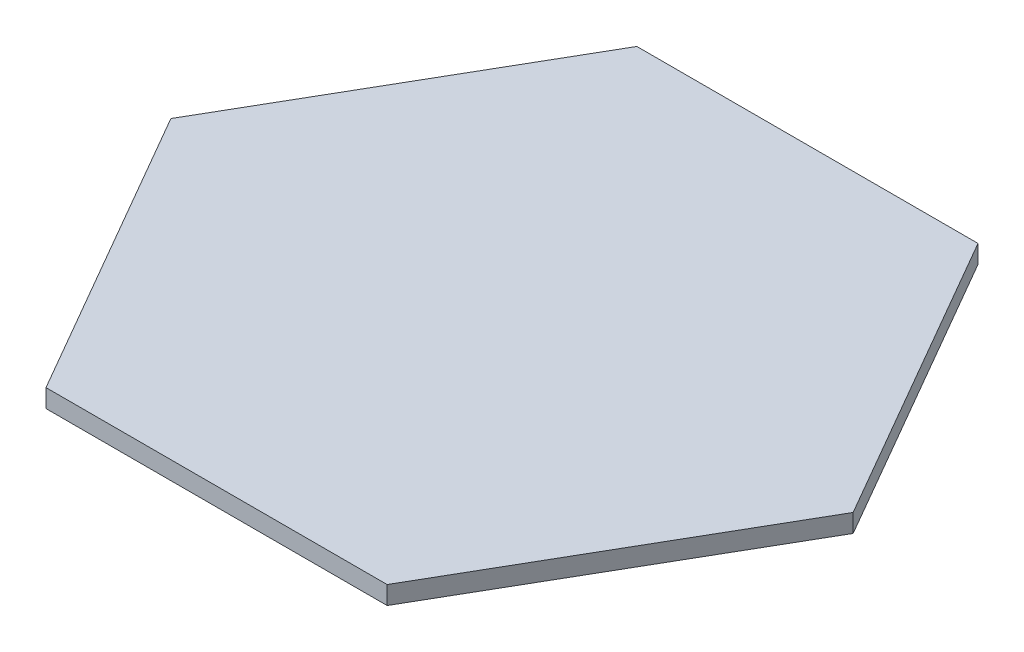
ISO-10303-21;
HEADER;
FILE_DESCRIPTION(('STEP AP214'),'2;1');
FILE_NAME('part.step','',(''),(''),'','','');
FILE_SCHEMA(('AUTOMOTIVE_DESIGN { 1 0 10303 214 1 1 1 1 }'));
ENDSEC;
DATA;
#1=APPLICATION_CONTEXT('core data for automotive mechanical design processes');
#2=APPLICATION_PROTOCOL_DEFINITION('international standard','automotive_design',2000,#1);
#3=PRODUCT_CONTEXT('',#1,'mechanical');
#4=PRODUCT('Part','Part','',(#3));
#5=PRODUCT_RELATED_PRODUCT_CATEGORY('part','',(#4));
#6=PRODUCT_DEFINITION_FORMATION('','',#4);
#7=PRODUCT_DEFINITION_CONTEXT('part definition',#1,'design');
#8=PRODUCT_DEFINITION('design','',#6,#7);
#9=PRODUCT_DEFINITION_SHAPE('','',#8);
#10=(LENGTH_UNIT() NAMED_UNIT(*) SI_UNIT(.MILLI.,.METRE.));
#11=(NAMED_UNIT(*) PLANE_ANGLE_UNIT() SI_UNIT($,.RADIAN.));
#12=(NAMED_UNIT(*) SI_UNIT($,.STERADIAN.) SOLID_ANGLE_UNIT());
#13=UNCERTAINTY_MEASURE_WITH_UNIT(LENGTH_MEASURE(1.E-05),#10,'distance_accuracy_value','');
#14=(GEOMETRIC_REPRESENTATION_CONTEXT(3) GLOBAL_UNCERTAINTY_ASSIGNED_CONTEXT((#13)) GLOBAL_UNIT_ASSIGNED_CONTEXT((#10,
#11,#12)) REPRESENTATION_CONTEXT('',''));
#15=CARTESIAN_POINT('',(0.,0.,0.));
#16=DIRECTION('',(0.,0.,1.));
#17=DIRECTION('',(1.,0.,0.));
#18=AXIS2_PLACEMENT_3D('',#15,#16,#17);
#19=CARTESIAN_POINT('',(-95.25,5.08,0.));
#20=DIRECTION('',(0.866025403784439,0.,-0.5));
#21=DIRECTION('',(-0.5,0.,-0.866025403784439));
#22=AXIS2_PLACEMENT_3D('',#19,#20,#21);
#23=PLANE('',#22);
#24=DIRECTION('',(0.5,0.,0.866025403784439));
#25=VECTOR('',#24,1.);
#26=CARTESIAN_POINT('',(-95.25,0.,0.));
#27=LINE('',#26,#25);
#28=CARTESIAN_POINT('',(-95.25,0.,0.));
#29=VERTEX_POINT('',#28);
#30=CARTESIAN_POINT('',(-47.625,0.,82.4889197104678));
#31=VERTEX_POINT('',#30);
#32=EDGE_CURVE('E116',#29,#31,#27,.T.);
#33=ORIENTED_EDGE('',*,*,#32,.T.);
#34=DIRECTION('',(0.,-1.,0.));
#35=VECTOR('',#34,1.);
#36=CARTESIAN_POINT('',(-47.625,5.08,82.4889197104678));
#37=LINE('',#36,#35);
#38=CARTESIAN_POINT('',(-47.625,5.08,82.4889197104678));
#39=VERTEX_POINT('',#38);
#40=EDGE_CURVE('E11',#39,#31,#37,.T.);
#41=ORIENTED_EDGE('',*,*,#40,.F.);
#42=DIRECTION('',(0.5,0.,0.866025403784439));
#43=VECTOR('',#42,1.);
#44=CARTESIAN_POINT('',(-95.25,5.08,0.));
#45=LINE('',#44,#43);
#46=CARTESIAN_POINT('',(-95.25,5.08,0.));
#47=VERTEX_POINT('',#46);
#48=EDGE_CURVE('E126',#47,#39,#45,.T.);
#49=ORIENTED_EDGE('',*,*,#48,.F.);
#50=DIRECTION('',(0.,-1.,0.));
#51=VECTOR('',#50,1.);
#52=CARTESIAN_POINT('',(-95.25,5.08,0.));
#53=LINE('',#52,#51);
#54=EDGE_CURVE('E112',#47,#29,#53,.T.);
#55=ORIENTED_EDGE('',*,*,#54,.T.);
#56=EDGE_LOOP('',(#33,#41,#49,#55));
#57=FACE_BOUND('',#56,.T.);
#58=ADVANCED_FACE('F32',(#57),#23,.F.);
#59=CARTESIAN_POINT('',(-47.625,5.08,82.4889197104678));
#60=DIRECTION('',(0.,0.,-1.));
#61=DIRECTION('',(-1.,0.,0.));
#62=AXIS2_PLACEMENT_3D('',#59,#60,#61);
#63=PLANE('',#62);
#64=DIRECTION('',(1.,0.,0.));
#65=VECTOR('',#64,1.);
#66=CARTESIAN_POINT('',(-47.625,0.,82.4889197104678));
#67=LINE('',#66,#65);
#68=CARTESIAN_POINT('',(47.6249999999999,0.,82.4889197104678));
#69=VERTEX_POINT('',#68);
#70=EDGE_CURVE('E119',#31,#69,#67,.T.);
#71=ORIENTED_EDGE('',*,*,#70,.T.);
#72=DIRECTION('',(0.,-1.,0.));
#73=VECTOR('',#72,1.);
#74=CARTESIAN_POINT('',(47.6249999999999,5.08,82.4889197104678));
#75=LINE('',#74,#73);
#76=CARTESIAN_POINT('',(47.6249999999999,5.08,82.4889197104678));
#77=VERTEX_POINT('',#76);
#78=EDGE_CURVE('E40',#77,#69,#75,.T.);
#79=ORIENTED_EDGE('',*,*,#78,.F.);
#80=DIRECTION('',(1.,0.,0.));
#81=VECTOR('',#80,1.);
#82=CARTESIAN_POINT('',(-47.625,5.08,82.4889197104678));
#83=LINE('',#82,#81);
#84=EDGE_CURVE('E85',#39,#77,#83,.T.);
#85=ORIENTED_EDGE('',*,*,#84,.F.);
#86=ORIENTED_EDGE('',*,*,#40,.T.);
#87=EDGE_LOOP('',(#71,#79,#85,#86));
#88=FACE_BOUND('',#87,.T.);
#89=ADVANCED_FACE('F150',(#88),#63,.F.);
#90=CARTESIAN_POINT('',(47.6249999999999,5.08,82.4889197104678));
#91=DIRECTION('',(-0.866025403784438,0.,-0.500000000000001));
#92=DIRECTION('',(-0.500000000000001,0.,0.866025403784438));
#93=AXIS2_PLACEMENT_3D('',#90,#91,#92);
#94=PLANE('',#93);
#95=DIRECTION('',(0.500000000000001,0.,-0.866025403784438));
#96=VECTOR('',#95,1.);
#97=CARTESIAN_POINT('',(47.6249999999999,0.,82.4889197104678));
#98=LINE('',#97,#96);
#99=CARTESIAN_POINT('',(95.25,0.,0.));
#100=VERTEX_POINT('',#99);
#101=EDGE_CURVE('E121',#69,#100,#98,.T.);
#102=ORIENTED_EDGE('',*,*,#101,.T.);
#103=DIRECTION('',(0.,-1.,0.));
#104=VECTOR('',#103,1.);
#105=CARTESIAN_POINT('',(95.25,5.08,0.));
#106=LINE('',#105,#104);
#107=CARTESIAN_POINT('',(95.25,5.08,0.));
#108=VERTEX_POINT('',#107);
#109=EDGE_CURVE('E107',#108,#100,#106,.T.);
#110=ORIENTED_EDGE('',*,*,#109,.F.);
#111=DIRECTION('',(0.500000000000001,0.,-0.866025403784438));
#112=VECTOR('',#111,1.);
#113=CARTESIAN_POINT('',(47.6249999999999,5.08,82.4889197104678));
#114=LINE('',#113,#112);
#115=EDGE_CURVE('E98',#77,#108,#114,.T.);
#116=ORIENTED_EDGE('',*,*,#115,.F.);
#117=ORIENTED_EDGE('',*,*,#78,.T.);
#118=EDGE_LOOP('',(#102,#110,#116,#117));
#119=FACE_BOUND('',#118,.T.);
#120=ADVANCED_FACE('F132',(#119),#94,.F.);
#121=CARTESIAN_POINT('',(95.25,5.08,0.));
#122=DIRECTION('',(-0.866025403784438,0.,0.500000000000001));
#123=DIRECTION('',(0.500000000000001,0.,0.866025403784438));
#124=AXIS2_PLACEMENT_3D('',#121,#122,#123);
#125=PLANE('',#124);
#126=DIRECTION('',(-0.500000000000001,0.,-0.866025403784438));
#127=VECTOR('',#126,1.);
#128=CARTESIAN_POINT('',(95.25,0.,0.));
#129=LINE('',#128,#127);
#130=CARTESIAN_POINT('',(47.6249999999999,0.,-82.4889197104678));
#131=VERTEX_POINT('',#130);
#132=EDGE_CURVE('E106',#100,#131,#129,.T.);
#133=ORIENTED_EDGE('',*,*,#132,.T.);
#134=DIRECTION('',(0.,-1.,0.));
#135=VECTOR('',#134,1.);
#136=CARTESIAN_POINT('',(47.6249999999999,5.08,-82.4889197104678));
#137=LINE('',#136,#135);
#138=CARTESIAN_POINT('',(47.6249999999999,5.08,-82.4889197104678));
#139=VERTEX_POINT('',#138);
#140=EDGE_CURVE('E103',#139,#131,#137,.T.);
#141=ORIENTED_EDGE('',*,*,#140,.F.);
#142=DIRECTION('',(-0.500000000000001,0.,-0.866025403784438));
#143=VECTOR('',#142,1.);
#144=CARTESIAN_POINT('',(95.25,5.08,0.));
#145=LINE('',#144,#143);
#146=EDGE_CURVE('E92',#108,#139,#145,.T.);
#147=ORIENTED_EDGE('',*,*,#146,.F.);
#148=ORIENTED_EDGE('',*,*,#109,.T.);
#149=EDGE_LOOP('',(#133,#141,#147,#148));
#150=FACE_BOUND('',#149,.T.);
#151=ADVANCED_FACE('F104',(#150),#125,.F.);
#152=CARTESIAN_POINT('',(47.6249999999999,5.08,-82.4889197104678));
#153=DIRECTION('',(0.,0.,1.));
#154=DIRECTION('',(1.,0.,0.));
#155=AXIS2_PLACEMENT_3D('',#152,#153,#154);
#156=PLANE('',#155);
#157=DIRECTION('',(-1.,0.,0.));
#158=VECTOR('',#157,1.);
#159=CARTESIAN_POINT('',(47.6249999999999,0.,-82.4889197104678));
#160=LINE('',#159,#158);
#161=CARTESIAN_POINT('',(-47.6249999999999,0.,-82.4889197104678));
#162=VERTEX_POINT('',#161);
#163=EDGE_CURVE('E71',#131,#162,#160,.T.);
#164=ORIENTED_EDGE('',*,*,#163,.T.);
#165=DIRECTION('',(0.,-1.,0.));
#166=VECTOR('',#165,1.);
#167=CARTESIAN_POINT('',(-47.6249999999999,5.08,-82.4889197104678));
#168=LINE('',#167,#166);
#169=CARTESIAN_POINT('',(-47.6249999999999,5.08,-82.4889197104678));
#170=VERTEX_POINT('',#169);
#171=EDGE_CURVE('E108',#170,#162,#168,.T.);
#172=ORIENTED_EDGE('',*,*,#171,.F.);
#173=DIRECTION('',(-1.,0.,0.));
#174=VECTOR('',#173,1.);
#175=CARTESIAN_POINT('',(47.6249999999999,5.08,-82.4889197104678));
#176=LINE('',#175,#174);
#177=EDGE_CURVE('E96',#139,#170,#176,.T.);
#178=ORIENTED_EDGE('',*,*,#177,.F.);
#179=ORIENTED_EDGE('',*,*,#140,.T.);
#180=EDGE_LOOP('',(#164,#172,#178,#179));
#181=FACE_BOUND('',#180,.T.);
#182=ADVANCED_FACE('F110',(#181),#156,.F.);
#183=CARTESIAN_POINT('',(-47.6249999999999,5.08,-82.4889197104678));
#184=DIRECTION('',(0.866025403784438,0.,0.5));
#185=DIRECTION('',(0.500000000000001,0.,-0.866025403784438));
#186=AXIS2_PLACEMENT_3D('',#183,#184,#185);
#187=PLANE('',#186);
#188=DIRECTION('',(-0.5,0.,0.866025403784438));
#189=VECTOR('',#188,1.);
#190=CARTESIAN_POINT('',(-47.6249999999999,0.,-82.4889197104678));
#191=LINE('',#190,#189);
#192=EDGE_CURVE('E77',#162,#29,#191,.T.);
#193=ORIENTED_EDGE('',*,*,#192,.T.);
#194=ORIENTED_EDGE('',*,*,#54,.F.);
#195=DIRECTION('',(-0.5,0.,0.866025403784438));
#196=VECTOR('',#195,1.);
#197=CARTESIAN_POINT('',(-47.6249999999999,5.08,-82.4889197104678));
#198=LINE('',#197,#196);
#199=EDGE_CURVE('E48',#170,#47,#198,.T.);
#200=ORIENTED_EDGE('',*,*,#199,.F.);
#201=ORIENTED_EDGE('',*,*,#171,.T.);
#202=EDGE_LOOP('',(#193,#194,#200,#201));
#203=FACE_BOUND('',#202,.T.);
#204=ADVANCED_FACE('F139',(#203),#187,.F.);
#205=CARTESIAN_POINT('',(0.,5.08,0.));
#206=DIRECTION('',(0.,1.,0.));
#207=DIRECTION('',(0.,0.,1.));
#208=AXIS2_PLACEMENT_3D('',#205,#206,#207);
#209=PLANE('',#208);
#210=ORIENTED_EDGE('',*,*,#48,.T.);
#211=ORIENTED_EDGE('',*,*,#84,.T.);
#212=ORIENTED_EDGE('',*,*,#115,.T.);
#213=ORIENTED_EDGE('',*,*,#146,.T.);
#214=ORIENTED_EDGE('',*,*,#177,.T.);
#215=ORIENTED_EDGE('',*,*,#199,.T.);
#216=EDGE_LOOP('',(#210,#211,#212,#213,#214,#215));
#217=FACE_BOUND('',#216,.T.);
#218=ADVANCED_FACE('F94',(#217),#209,.T.);
#219=CARTESIAN_POINT('',(0.,0.,0.));
#220=DIRECTION('',(0.,1.,0.));
#221=DIRECTION('',(0.,0.,1.));
#222=AXIS2_PLACEMENT_3D('',#219,#220,#221);
#223=PLANE('',#222);
#224=ORIENTED_EDGE('',*,*,#32,.F.);
#225=ORIENTED_EDGE('',*,*,#192,.F.);
#226=ORIENTED_EDGE('',*,*,#163,.F.);
#227=ORIENTED_EDGE('',*,*,#132,.F.);
#228=ORIENTED_EDGE('',*,*,#101,.F.);
#229=ORIENTED_EDGE('',*,*,#70,.F.);
#230=EDGE_LOOP('',(#224,#225,#226,#227,#228,#229));
#231=FACE_BOUND('',#230,.T.);
#232=ADVANCED_FACE('F135',(#231),#223,.F.);
#233=CLOSED_SHELL('',(#58,#89,#120,#151,#182,#204,#218,#232));
#234=MANIFOLD_SOLID_BREP('B2',#233);
#235=ADVANCED_BREP_SHAPE_REPRESENTATION('',(#18,#234),#14);
#236=SHAPE_DEFINITION_REPRESENTATION(#9,#235);
ENDSEC;
END-ISO-10303-21;
